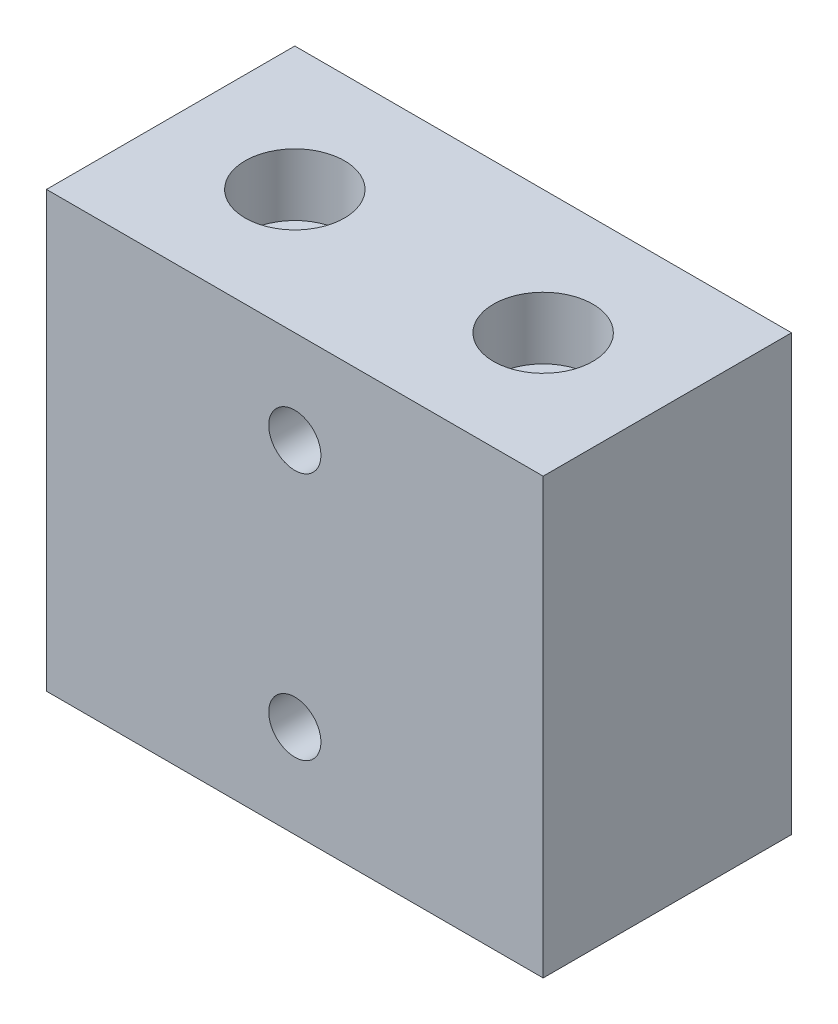
ISO-10303-21;
HEADER;
FILE_DESCRIPTION(('STEP AP214'),'2;1');
FILE_NAME('part.step','',(''),(''),'','','');
FILE_SCHEMA(('AUTOMOTIVE_DESIGN { 1 0 10303 214 1 1 1 1 }'));
ENDSEC;
DATA;
#1=APPLICATION_CONTEXT('core data for automotive mechanical design processes');
#2=APPLICATION_PROTOCOL_DEFINITION('international standard','automotive_design',2000,#1);
#3=PRODUCT_CONTEXT('',#1,'mechanical');
#4=PRODUCT('Part','Part','',(#3));
#5=PRODUCT_RELATED_PRODUCT_CATEGORY('part','',(#4));
#6=PRODUCT_DEFINITION_FORMATION('','',#4);
#7=PRODUCT_DEFINITION_CONTEXT('part definition',#1,'design');
#8=PRODUCT_DEFINITION('design','',#6,#7);
#9=PRODUCT_DEFINITION_SHAPE('','',#8);
#10=(LENGTH_UNIT() NAMED_UNIT(*) SI_UNIT(.MILLI.,.METRE.));
#11=(NAMED_UNIT(*) PLANE_ANGLE_UNIT() SI_UNIT($,.RADIAN.));
#12=(NAMED_UNIT(*) SI_UNIT($,.STERADIAN.) SOLID_ANGLE_UNIT());
#13=UNCERTAINTY_MEASURE_WITH_UNIT(LENGTH_MEASURE(1.E-05),#10,'distance_accuracy_value','');
#14=(GEOMETRIC_REPRESENTATION_CONTEXT(3) GLOBAL_UNCERTAINTY_ASSIGNED_CONTEXT((#13)) GLOBAL_UNIT_ASSIGNED_CONTEXT((#10,
#11,#12)) REPRESENTATION_CONTEXT('',''));
#15=CARTESIAN_POINT('',(0.,0.,0.));
#16=DIRECTION('',(0.,0.,1.));
#17=DIRECTION('',(1.,0.,0.));
#18=AXIS2_PLACEMENT_3D('',#15,#16,#17);
#19=CARTESIAN_POINT('',(-10.,35.,0.));
#20=DIRECTION('',(0.,-1.,0.));
#21=DIRECTION('',(0.,0.,-1.));
#22=AXIS2_PLACEMENT_3D('',#19,#20,#21);
#23=CYLINDRICAL_SURFACE('',#22,2.5);
#24=CARTESIAN_POINT('',(-10.,0.,0.));
#25=DIRECTION('',(0.,1.,0.));
#26=DIRECTION('',(0.,0.,1.));
#27=AXIS2_PLACEMENT_3D('',#24,#25,#26);
#28=CIRCLE('',#27,2.5);
#29=CARTESIAN_POINT('',(-10.,0.,2.50000000000001));
#30=VERTEX_POINT('',#29);
#31=EDGE_CURVE('E103',#30,#30,#28,.T.);
#32=ORIENTED_EDGE('',*,*,#31,.F.);
#33=EDGE_LOOP('',(#32));
#34=FACE_BOUND('',#33,.T.);
#35=CARTESIAN_POINT('',(-10.,30.,0.));
#36=DIRECTION('',(0.,1.,0.));
#37=DIRECTION('',(0.,0.,1.));
#38=AXIS2_PLACEMENT_3D('',#35,#36,#37);
#39=CIRCLE('',#38,2.5);
#40=CARTESIAN_POINT('',(-10.,30.,2.50000000000001));
#41=VERTEX_POINT('',#40);
#42=EDGE_CURVE('E37',#41,#41,#39,.T.);
#43=ORIENTED_EDGE('',*,*,#42,.T.);
#44=EDGE_LOOP('',(#43));
#45=FACE_BOUND('',#44,.T.);
#46=ADVANCED_FACE('F33',(#34,#45),#23,.F.);
#47=CARTESIAN_POINT('',(10.,35.,0.));
#48=DIRECTION('',(0.,-1.,0.));
#49=DIRECTION('',(0.,0.,-1.));
#50=AXIS2_PLACEMENT_3D('',#47,#48,#49);
#51=CYLINDRICAL_SURFACE('',#50,2.5);
#52=CARTESIAN_POINT('',(10.,0.,0.));
#53=DIRECTION('',(0.,1.,0.));
#54=DIRECTION('',(0.,0.,1.));
#55=AXIS2_PLACEMENT_3D('',#52,#53,#54);
#56=CIRCLE('',#55,2.5);
#57=CARTESIAN_POINT('',(10.,0.,2.5));
#58=VERTEX_POINT('',#57);
#59=EDGE_CURVE('E114',#58,#58,#56,.T.);
#60=ORIENTED_EDGE('',*,*,#59,.F.);
#61=EDGE_LOOP('',(#60));
#62=FACE_BOUND('',#61,.T.);
#63=CARTESIAN_POINT('',(10.,30.,0.));
#64=DIRECTION('',(0.,1.,0.));
#65=DIRECTION('',(0.,0.,1.));
#66=AXIS2_PLACEMENT_3D('',#63,#64,#65);
#67=CIRCLE('',#66,2.5);
#68=CARTESIAN_POINT('',(10.,30.,2.5));
#69=VERTEX_POINT('',#68);
#70=EDGE_CURVE('E108',#69,#69,#67,.T.);
#71=ORIENTED_EDGE('',*,*,#70,.T.);
#72=EDGE_LOOP('',(#71));
#73=FACE_BOUND('',#72,.T.);
#74=ADVANCED_FACE('F143',(#62,#73),#51,.F.);
#75=CARTESIAN_POINT('',(0.,35.,0.));
#76=DIRECTION('',(0.,1.,0.));
#77=DIRECTION('',(0.,0.,1.));
#78=AXIS2_PLACEMENT_3D('',#75,#76,#77);
#79=PLANE('',#78);
#80=CARTESIAN_POINT('',(-10.,35.,0.));
#81=DIRECTION('',(0.,1.,0.));
#82=DIRECTION('',(0.,0.,1.));
#83=AXIS2_PLACEMENT_3D('',#80,#81,#82);
#84=CIRCLE('',#83,4.);
#85=CARTESIAN_POINT('',(-10.,35.,4.));
#86=VERTEX_POINT('',#85);
#87=EDGE_CURVE('E116',#86,#86,#84,.T.);
#88=ORIENTED_EDGE('',*,*,#87,.F.);
#89=EDGE_LOOP('',(#88));
#90=FACE_BOUND('',#89,.T.);
#91=CARTESIAN_POINT('',(10.,35.,0.));
#92=DIRECTION('',(0.,1.,0.));
#93=DIRECTION('',(0.,0.,1.));
#94=AXIS2_PLACEMENT_3D('',#91,#92,#93);
#95=CIRCLE('',#94,4.);
#96=CARTESIAN_POINT('',(10.,35.,4.));
#97=VERTEX_POINT('',#96);
#98=EDGE_CURVE('E129',#97,#97,#95,.T.);
#99=ORIENTED_EDGE('',*,*,#98,.F.);
#100=EDGE_LOOP('',(#99));
#101=FACE_BOUND('',#100,.T.);
#102=DIRECTION('',(0.,0.,-1.));
#103=VECTOR('',#102,1.);
#104=CARTESIAN_POINT('',(20.,35.,-10.));
#105=LINE('',#104,#103);
#106=CARTESIAN_POINT('',(20.,35.,10.));
#107=VERTEX_POINT('',#106);
#108=CARTESIAN_POINT('',(20.,35.,-10.));
#109=VERTEX_POINT('',#108);
#110=EDGE_CURVE('E87',#107,#109,#105,.T.);
#111=ORIENTED_EDGE('',*,*,#110,.T.);
#112=DIRECTION('',(-1.,0.,0.));
#113=VECTOR('',#112,1.);
#114=CARTESIAN_POINT('',(-20.,35.,-10.));
#115=LINE('',#114,#113);
#116=CARTESIAN_POINT('',(-20.,35.,-10.));
#117=VERTEX_POINT('',#116);
#118=EDGE_CURVE('E82',#109,#117,#115,.T.);
#119=ORIENTED_EDGE('',*,*,#118,.T.);
#120=DIRECTION('',(0.,0.,1.));
#121=VECTOR('',#120,1.);
#122=CARTESIAN_POINT('',(-20.,35.,-10.));
#123=LINE('',#122,#121);
#124=CARTESIAN_POINT('',(-20.,35.,10.));
#125=VERTEX_POINT('',#124);
#126=EDGE_CURVE('E85',#117,#125,#123,.T.);
#127=ORIENTED_EDGE('',*,*,#126,.T.);
#128=DIRECTION('',(1.,0.,0.));
#129=VECTOR('',#128,1.);
#130=CARTESIAN_POINT('',(-20.,35.,10.));
#131=LINE('',#130,#129);
#132=EDGE_CURVE('E52',#125,#107,#131,.T.);
#133=ORIENTED_EDGE('',*,*,#132,.T.);
#134=EDGE_LOOP('',(#111,#119,#127,#133));
#135=FACE_BOUND('',#134,.T.);
#136=ADVANCED_FACE('F83',(#90,#101,#135),#79,.T.);
#137=CARTESIAN_POINT('',(0.,0.,0.));
#138=DIRECTION('',(0.,1.,0.));
#139=DIRECTION('',(0.,0.,1.));
#140=AXIS2_PLACEMENT_3D('',#137,#138,#139);
#141=PLANE('',#140);
#142=DIRECTION('',(0.,0.,-1.));
#143=VECTOR('',#142,1.);
#144=CARTESIAN_POINT('',(20.,0.,-10.));
#145=LINE('',#144,#143);
#146=CARTESIAN_POINT('',(20.,0.,10.));
#147=VERTEX_POINT('',#146);
#148=CARTESIAN_POINT('',(20.,0.,-10.));
#149=VERTEX_POINT('',#148);
#150=EDGE_CURVE('E100',#147,#149,#145,.T.);
#151=ORIENTED_EDGE('',*,*,#150,.F.);
#152=DIRECTION('',(1.,0.,0.));
#153=VECTOR('',#152,1.);
#154=CARTESIAN_POINT('',(-20.,0.,10.));
#155=LINE('',#154,#153);
#156=CARTESIAN_POINT('',(-20.,0.,10.));
#157=VERTEX_POINT('',#156);
#158=EDGE_CURVE('E75',#157,#147,#155,.T.);
#159=ORIENTED_EDGE('',*,*,#158,.F.);
#160=DIRECTION('',(0.,0.,1.));
#161=VECTOR('',#160,1.);
#162=CARTESIAN_POINT('',(-20.,0.,-10.));
#163=LINE('',#162,#161);
#164=CARTESIAN_POINT('',(-20.,0.,-10.));
#165=VERTEX_POINT('',#164);
#166=EDGE_CURVE('E69',#165,#157,#163,.T.);
#167=ORIENTED_EDGE('',*,*,#166,.F.);
#168=DIRECTION('',(-1.,0.,0.));
#169=VECTOR('',#168,1.);
#170=CARTESIAN_POINT('',(-20.,0.,-10.));
#171=LINE('',#170,#169);
#172=EDGE_CURVE('E91',#149,#165,#171,.T.);
#173=ORIENTED_EDGE('',*,*,#172,.F.);
#174=EDGE_LOOP('',(#151,#159,#167,#173));
#175=FACE_BOUND('',#174,.T.);
#176=ORIENTED_EDGE('',*,*,#31,.T.);
#177=EDGE_LOOP('',(#176));
#178=FACE_BOUND('',#177,.T.);
#179=ORIENTED_EDGE('',*,*,#59,.T.);
#180=EDGE_LOOP('',(#179));
#181=FACE_BOUND('',#180,.T.);
#182=ADVANCED_FACE('F138',(#175,#178,#181),#141,.F.);
#183=CARTESIAN_POINT('',(20.,35.,-10.));
#184=DIRECTION('',(-1.,0.,0.));
#185=DIRECTION('',(0.,0.,1.));
#186=AXIS2_PLACEMENT_3D('',#183,#184,#185);
#187=PLANE('',#186);
#188=ORIENTED_EDGE('',*,*,#150,.T.);
#189=DIRECTION('',(0.,-1.,0.));
#190=VECTOR('',#189,1.);
#191=CARTESIAN_POINT('',(20.,35.,-10.));
#192=LINE('',#191,#190);
#193=EDGE_CURVE('E11',#109,#149,#192,.T.);
#194=ORIENTED_EDGE('',*,*,#193,.F.);
#195=ORIENTED_EDGE('',*,*,#110,.F.);
#196=DIRECTION('',(0.,-1.,0.));
#197=VECTOR('',#196,1.);
#198=CARTESIAN_POINT('',(20.,35.,10.));
#199=LINE('',#198,#197);
#200=EDGE_CURVE('E96',#107,#147,#199,.T.);
#201=ORIENTED_EDGE('',*,*,#200,.T.);
#202=EDGE_LOOP('',(#188,#194,#195,#201));
#203=FACE_BOUND('',#202,.T.);
#204=ADVANCED_FACE('F35',(#203),#187,.F.);
#205=CARTESIAN_POINT('',(-20.,35.,-10.));
#206=DIRECTION('',(0.,0.,1.));
#207=DIRECTION('',(1.,0.,0.));
#208=AXIS2_PLACEMENT_3D('',#205,#206,#207);
#209=PLANE('',#208);
#210=CARTESIAN_POINT('',(0.,27.5,-10.));
#211=DIRECTION('',(0.,0.,1.));
#212=DIRECTION('',(1.,0.,0.));
#213=AXIS2_PLACEMENT_3D('',#210,#211,#212);
#214=CIRCLE('',#213,2.1);
#215=CARTESIAN_POINT('',(2.1,27.5,-10.));
#216=VERTEX_POINT('',#215);
#217=EDGE_CURVE('E132',#216,#216,#214,.T.);
#218=ORIENTED_EDGE('',*,*,#217,.T.);
#219=EDGE_LOOP('',(#218));
#220=FACE_BOUND('',#219,.T.);
#221=CARTESIAN_POINT('',(0.,7.5,-10.));
#222=DIRECTION('',(0.,0.,1.));
#223=DIRECTION('',(1.,0.,0.));
#224=AXIS2_PLACEMENT_3D('',#221,#222,#223);
#225=CIRCLE('',#224,2.1);
#226=CARTESIAN_POINT('',(2.1,7.5,-10.));
#227=VERTEX_POINT('',#226);
#228=EDGE_CURVE('E196',#227,#227,#225,.T.);
#229=ORIENTED_EDGE('',*,*,#228,.T.);
#230=EDGE_LOOP('',(#229));
#231=FACE_BOUND('',#230,.T.);
#232=ORIENTED_EDGE('',*,*,#172,.T.);
#233=DIRECTION('',(0.,-1.,0.));
#234=VECTOR('',#233,1.);
#235=CARTESIAN_POINT('',(-20.,35.,-10.));
#236=LINE('',#235,#234);
#237=EDGE_CURVE('E43',#117,#165,#236,.T.);
#238=ORIENTED_EDGE('',*,*,#237,.F.);
#239=ORIENTED_EDGE('',*,*,#118,.F.);
#240=ORIENTED_EDGE('',*,*,#193,.T.);
#241=EDGE_LOOP('',(#232,#238,#239,#240));
#242=FACE_BOUND('',#241,.T.);
#243=ADVANCED_FACE('F90',(#220,#231,#242),#209,.F.);
#244=CARTESIAN_POINT('',(-20.,35.,-10.));
#245=DIRECTION('',(1.,0.,0.));
#246=DIRECTION('',(0.,0.,-1.));
#247=AXIS2_PLACEMENT_3D('',#244,#245,#246);
#248=PLANE('',#247);
#249=ORIENTED_EDGE('',*,*,#166,.T.);
#250=DIRECTION('',(0.,-1.,0.));
#251=VECTOR('',#250,1.);
#252=CARTESIAN_POINT('',(-20.,35.,10.));
#253=LINE('',#252,#251);
#254=EDGE_CURVE('E92',#125,#157,#253,.T.);
#255=ORIENTED_EDGE('',*,*,#254,.F.);
#256=ORIENTED_EDGE('',*,*,#126,.F.);
#257=ORIENTED_EDGE('',*,*,#237,.T.);
#258=EDGE_LOOP('',(#249,#255,#256,#257));
#259=FACE_BOUND('',#258,.T.);
#260=ADVANCED_FACE('F94',(#259),#248,.F.);
#261=CARTESIAN_POINT('',(-20.,35.,10.));
#262=DIRECTION('',(0.,0.,-1.));
#263=DIRECTION('',(-1.,0.,0.));
#264=AXIS2_PLACEMENT_3D('',#261,#262,#263);
#265=PLANE('',#264);
#266=CARTESIAN_POINT('',(0.,27.5,10.));
#267=DIRECTION('',(0.,0.,1.));
#268=DIRECTION('',(1.,0.,0.));
#269=AXIS2_PLACEMENT_3D('',#266,#267,#268);
#270=CIRCLE('',#269,2.1);
#271=CARTESIAN_POINT('',(2.1,27.5,10.));
#272=VERTEX_POINT('',#271);
#273=EDGE_CURVE('E197',#272,#272,#270,.T.);
#274=ORIENTED_EDGE('',*,*,#273,.F.);
#275=EDGE_LOOP('',(#274));
#276=FACE_BOUND('',#275,.T.);
#277=CARTESIAN_POINT('',(0.,7.5,10.));
#278=DIRECTION('',(0.,0.,1.));
#279=DIRECTION('',(1.,0.,0.));
#280=AXIS2_PLACEMENT_3D('',#277,#278,#279);
#281=CIRCLE('',#280,2.1);
#282=CARTESIAN_POINT('',(2.1,7.5,10.));
#283=VERTEX_POINT('',#282);
#284=EDGE_CURVE('E124',#283,#283,#281,.T.);
#285=ORIENTED_EDGE('',*,*,#284,.F.);
#286=EDGE_LOOP('',(#285));
#287=FACE_BOUND('',#286,.T.);
#288=ORIENTED_EDGE('',*,*,#158,.T.);
#289=ORIENTED_EDGE('',*,*,#200,.F.);
#290=ORIENTED_EDGE('',*,*,#132,.F.);
#291=ORIENTED_EDGE('',*,*,#254,.T.);
#292=EDGE_LOOP('',(#288,#289,#290,#291));
#293=FACE_BOUND('',#292,.T.);
#294=ADVANCED_FACE('F170',(#276,#287,#293),#265,.F.);
#295=CARTESIAN_POINT('',(10.,30.,0.));
#296=DIRECTION('',(0.,1.,0.));
#297=DIRECTION('',(0.,0.,1.));
#298=AXIS2_PLACEMENT_3D('',#295,#296,#297);
#299=CYLINDRICAL_SURFACE('',#298,4.);
#300=CARTESIAN_POINT('',(10.,30.,0.));
#301=DIRECTION('',(0.,1.,0.));
#302=DIRECTION('',(0.,0.,1.));
#303=AXIS2_PLACEMENT_3D('',#300,#301,#302);
#304=CIRCLE('',#303,4.);
#305=CARTESIAN_POINT('',(10.,30.,4.));
#306=VERTEX_POINT('',#305);
#307=EDGE_CURVE('E121',#306,#306,#304,.T.);
#308=ORIENTED_EDGE('',*,*,#307,.F.);
#309=EDGE_LOOP('',(#308));
#310=FACE_BOUND('',#309,.T.);
#311=ORIENTED_EDGE('',*,*,#98,.T.);
#312=EDGE_LOOP('',(#311));
#313=FACE_BOUND('',#312,.T.);
#314=ADVANCED_FACE('F166',(#310,#313),#299,.F.);
#315=CARTESIAN_POINT('',(10.,30.,0.));
#316=DIRECTION('',(0.,1.,0.));
#317=DIRECTION('',(0.,0.,1.));
#318=AXIS2_PLACEMENT_3D('',#315,#316,#317);
#319=PLANE('',#318);
#320=ORIENTED_EDGE('',*,*,#70,.F.);
#321=EDGE_LOOP('',(#320));
#322=FACE_BOUND('',#321,.T.);
#323=ORIENTED_EDGE('',*,*,#307,.T.);
#324=EDGE_LOOP('',(#323));
#325=FACE_BOUND('',#324,.T.);
#326=ADVANCED_FACE('F159',(#322,#325),#319,.T.);
#327=CARTESIAN_POINT('',(-10.,30.,0.));
#328=DIRECTION('',(0.,1.,0.));
#329=DIRECTION('',(0.,0.,1.));
#330=AXIS2_PLACEMENT_3D('',#327,#328,#329);
#331=CYLINDRICAL_SURFACE('',#330,4.);
#332=CARTESIAN_POINT('',(-10.,30.,0.));
#333=DIRECTION('',(0.,1.,0.));
#334=DIRECTION('',(0.,0.,1.));
#335=AXIS2_PLACEMENT_3D('',#332,#333,#334);
#336=CIRCLE('',#335,4.);
#337=CARTESIAN_POINT('',(-10.,30.,4.));
#338=VERTEX_POINT('',#337);
#339=EDGE_CURVE('E110',#338,#338,#336,.T.);
#340=ORIENTED_EDGE('',*,*,#339,.F.);
#341=EDGE_LOOP('',(#340));
#342=FACE_BOUND('',#341,.T.);
#343=ORIENTED_EDGE('',*,*,#87,.T.);
#344=EDGE_LOOP('',(#343));
#345=FACE_BOUND('',#344,.T.);
#346=ADVANCED_FACE('F150',(#342,#345),#331,.F.);
#347=CARTESIAN_POINT('',(-10.,30.,0.));
#348=DIRECTION('',(0.,1.,0.));
#349=DIRECTION('',(0.,0.,1.));
#350=AXIS2_PLACEMENT_3D('',#347,#348,#349);
#351=PLANE('',#350);
#352=ORIENTED_EDGE('',*,*,#42,.F.);
#353=EDGE_LOOP('',(#352));
#354=FACE_BOUND('',#353,.T.);
#355=ORIENTED_EDGE('',*,*,#339,.T.);
#356=EDGE_LOOP('',(#355));
#357=FACE_BOUND('',#356,.T.);
#358=ADVANCED_FACE('F147',(#354,#357),#351,.T.);
#359=CARTESIAN_POINT('',(0.,7.5,-10.));
#360=DIRECTION('',(0.,0.,1.));
#361=DIRECTION('',(1.,0.,0.));
#362=AXIS2_PLACEMENT_3D('',#359,#360,#361);
#363=CYLINDRICAL_SURFACE('',#362,2.1);
#364=ORIENTED_EDGE('',*,*,#228,.F.);
#365=EDGE_LOOP('',(#364));
#366=FACE_BOUND('',#365,.T.);
#367=ORIENTED_EDGE('',*,*,#284,.T.);
#368=EDGE_LOOP('',(#367));
#369=FACE_BOUND('',#368,.T.);
#370=ADVANCED_FACE('F149',(#366,#369),#363,.F.);
#371=CARTESIAN_POINT('',(0.,27.5,-10.));
#372=DIRECTION('',(0.,0.,1.));
#373=DIRECTION('',(1.,0.,0.));
#374=AXIS2_PLACEMENT_3D('',#371,#372,#373);
#375=CYLINDRICAL_SURFACE('',#374,2.1);
#376=ORIENTED_EDGE('',*,*,#217,.F.);
#377=EDGE_LOOP('',(#376));
#378=FACE_BOUND('',#377,.T.);
#379=ORIENTED_EDGE('',*,*,#273,.T.);
#380=EDGE_LOOP('',(#379));
#381=FACE_BOUND('',#380,.T.);
#382=ADVANCED_FACE('F156',(#378,#381),#375,.F.);
#383=CLOSED_SHELL('',(#46,#74,#136,#182,#204,#243,#260,#294,#314,#326,#346,#358,#370,#382));
#384=MANIFOLD_SOLID_BREP('B2',#383);
#385=ADVANCED_BREP_SHAPE_REPRESENTATION('',(#18,#384),#14);
#386=SHAPE_DEFINITION_REPRESENTATION(#9,#385);
ENDSEC;
END-ISO-10303-21;
